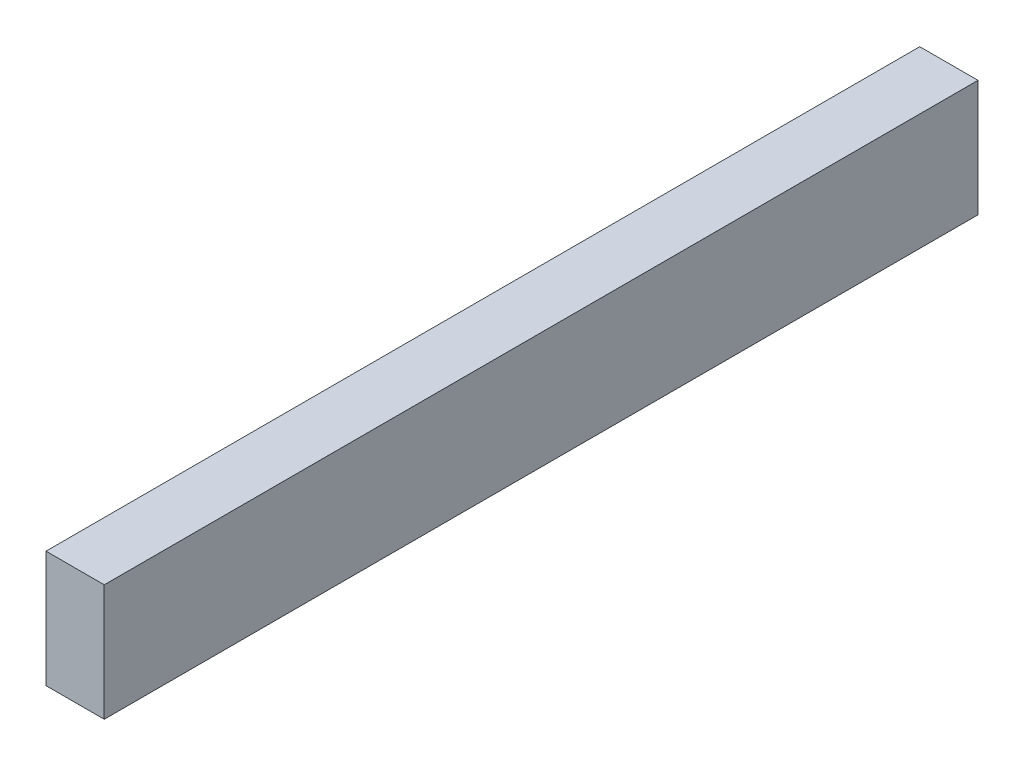
ISO-10303-21;
HEADER;
FILE_DESCRIPTION(('STEP AP214'),'2;1');
FILE_NAME('part.step','',(''),(''),'','','');
FILE_SCHEMA(('AUTOMOTIVE_DESIGN { 1 0 10303 214 1 1 1 1 }'));
ENDSEC;
DATA;
#1=APPLICATION_CONTEXT('core data for automotive mechanical design processes');
#2=APPLICATION_PROTOCOL_DEFINITION('international standard','automotive_design',2000,#1);
#3=PRODUCT_CONTEXT('',#1,'mechanical');
#4=PRODUCT('Part','Part','',(#3));
#5=PRODUCT_RELATED_PRODUCT_CATEGORY('part','',(#4));
#6=PRODUCT_DEFINITION_FORMATION('','',#4);
#7=PRODUCT_DEFINITION_CONTEXT('part definition',#1,'design');
#8=PRODUCT_DEFINITION('design','',#6,#7);
#9=PRODUCT_DEFINITION_SHAPE('','',#8);
#10=(LENGTH_UNIT() NAMED_UNIT(*) SI_UNIT(.MILLI.,.METRE.));
#11=(NAMED_UNIT(*) PLANE_ANGLE_UNIT() SI_UNIT($,.RADIAN.));
#12=(NAMED_UNIT(*) SI_UNIT($,.STERADIAN.) SOLID_ANGLE_UNIT());
#13=UNCERTAINTY_MEASURE_WITH_UNIT(LENGTH_MEASURE(1.E-05),#10,'distance_accuracy_value','');
#14=(GEOMETRIC_REPRESENTATION_CONTEXT(3) GLOBAL_UNCERTAINTY_ASSIGNED_CONTEXT((#13)) GLOBAL_UNIT_ASSIGNED_CONTEXT((#10,
#11,#12)) REPRESENTATION_CONTEXT('',''));
#15=CARTESIAN_POINT('',(0.,0.,0.));
#16=DIRECTION('',(0.,0.,1.));
#17=DIRECTION('',(1.,0.,0.));
#18=AXIS2_PLACEMENT_3D('',#15,#16,#17);
#19=CARTESIAN_POINT('',(0.,0.,381.));
#20=DIRECTION('',(1.,0.,0.));
#21=DIRECTION('',(0.,0.,-1.));
#22=AXIS2_PLACEMENT_3D('',#19,#20,#21);
#23=PLANE('',#22);
#24=DIRECTION('',(0.,-1.,0.));
#25=VECTOR('',#24,1.);
#26=CARTESIAN_POINT('',(0.,0.,0.));
#27=LINE('',#26,#25);
#28=CARTESIAN_POINT('',(0.,50.8,0.));
#29=VERTEX_POINT('',#28);
#30=CARTESIAN_POINT('',(0.,0.,0.));
#31=VERTEX_POINT('',#30);
#32=EDGE_CURVE('E111',#29,#31,#27,.T.);
#33=ORIENTED_EDGE('',*,*,#32,.T.);
#34=DIRECTION('',(0.,0.,-1.));
#35=VECTOR('',#34,1.);
#36=CARTESIAN_POINT('',(0.,0.,381.));
#37=LINE('',#36,#35);
#38=CARTESIAN_POINT('',(0.,0.,381.));
#39=VERTEX_POINT('',#38);
#40=EDGE_CURVE('E11',#39,#31,#37,.T.);
#41=ORIENTED_EDGE('',*,*,#40,.F.);
#42=DIRECTION('',(0.,-1.,0.));
#43=VECTOR('',#42,1.);
#44=CARTESIAN_POINT('',(0.,0.,381.));
#45=LINE('',#44,#43);
#46=CARTESIAN_POINT('',(0.,50.8,381.));
#47=VERTEX_POINT('',#46);
#48=EDGE_CURVE('E95',#47,#39,#45,.T.);
#49=ORIENTED_EDGE('',*,*,#48,.F.);
#50=DIRECTION('',(0.,0.,-1.));
#51=VECTOR('',#50,1.);
#52=CARTESIAN_POINT('',(0.,50.8,381.));
#53=LINE('',#52,#51);
#54=EDGE_CURVE('E107',#47,#29,#53,.T.);
#55=ORIENTED_EDGE('',*,*,#54,.T.);
#56=EDGE_LOOP('',(#33,#41,#49,#55));
#57=FACE_BOUND('',#56,.T.);
#58=ADVANCED_FACE('F43',(#57),#23,.F.);
#59=CARTESIAN_POINT('',(0.,0.,381.));
#60=DIRECTION('',(0.,1.,0.));
#61=DIRECTION('',(0.,0.,1.));
#62=AXIS2_PLACEMENT_3D('',#59,#60,#61);
#63=PLANE('',#62);
#64=DIRECTION('',(1.,0.,0.));
#65=VECTOR('',#64,1.);
#66=CARTESIAN_POINT('',(0.,0.,0.));
#67=LINE('',#66,#65);
#68=CARTESIAN_POINT('',(25.4,0.,0.));
#69=VERTEX_POINT('',#68);
#70=EDGE_CURVE('E100',#31,#69,#67,.T.);
#71=ORIENTED_EDGE('',*,*,#70,.T.);
#72=DIRECTION('',(0.,0.,-1.));
#73=VECTOR('',#72,1.);
#74=CARTESIAN_POINT('',(25.4,0.,381.));
#75=LINE('',#74,#73);
#76=CARTESIAN_POINT('',(25.4,0.,381.));
#77=VERTEX_POINT('',#76);
#78=EDGE_CURVE('E52',#77,#69,#75,.T.);
#79=ORIENTED_EDGE('',*,*,#78,.F.);
#80=DIRECTION('',(1.,0.,0.));
#81=VECTOR('',#80,1.);
#82=CARTESIAN_POINT('',(0.,0.,381.));
#83=LINE('',#82,#81);
#84=EDGE_CURVE('E90',#39,#77,#83,.T.);
#85=ORIENTED_EDGE('',*,*,#84,.F.);
#86=ORIENTED_EDGE('',*,*,#40,.T.);
#87=EDGE_LOOP('',(#71,#79,#85,#86));
#88=FACE_BOUND('',#87,.T.);
#89=ADVANCED_FACE('F99',(#88),#63,.F.);
#90=CARTESIAN_POINT('',(25.4,0.,381.));
#91=DIRECTION('',(-1.,0.,0.));
#92=DIRECTION('',(0.,0.,1.));
#93=AXIS2_PLACEMENT_3D('',#90,#91,#92);
#94=PLANE('',#93);
#95=DIRECTION('',(0.,1.,0.));
#96=VECTOR('',#95,1.);
#97=CARTESIAN_POINT('',(25.4,0.,0.));
#98=LINE('',#97,#96);
#99=CARTESIAN_POINT('',(25.4,50.8,0.));
#100=VERTEX_POINT('',#99);
#101=EDGE_CURVE('E77',#69,#100,#98,.T.);
#102=ORIENTED_EDGE('',*,*,#101,.T.);
#103=DIRECTION('',(0.,0.,-1.));
#104=VECTOR('',#103,1.);
#105=CARTESIAN_POINT('',(25.4,50.8,381.));
#106=LINE('',#105,#104);
#107=CARTESIAN_POINT('',(25.4,50.8,381.));
#108=VERTEX_POINT('',#107);
#109=EDGE_CURVE('E102',#108,#100,#106,.T.);
#110=ORIENTED_EDGE('',*,*,#109,.F.);
#111=DIRECTION('',(0.,1.,0.));
#112=VECTOR('',#111,1.);
#113=CARTESIAN_POINT('',(25.4,0.,381.));
#114=LINE('',#113,#112);
#115=EDGE_CURVE('E93',#77,#108,#114,.T.);
#116=ORIENTED_EDGE('',*,*,#115,.F.);
#117=ORIENTED_EDGE('',*,*,#78,.T.);
#118=EDGE_LOOP('',(#102,#110,#116,#117));
#119=FACE_BOUND('',#118,.T.);
#120=ADVANCED_FACE('F103',(#119),#94,.F.);
#121=CARTESIAN_POINT('',(0.,50.8,381.));
#122=DIRECTION('',(0.,-1.,0.));
#123=DIRECTION('',(0.,0.,-1.));
#124=AXIS2_PLACEMENT_3D('',#121,#122,#123);
#125=PLANE('',#124);
#126=DIRECTION('',(-1.,0.,0.));
#127=VECTOR('',#126,1.);
#128=CARTESIAN_POINT('',(0.,50.8,0.));
#129=LINE('',#128,#127);
#130=EDGE_CURVE('E83',#100,#29,#129,.T.);
#131=ORIENTED_EDGE('',*,*,#130,.T.);
#132=ORIENTED_EDGE('',*,*,#54,.F.);
#133=DIRECTION('',(-1.,0.,0.));
#134=VECTOR('',#133,1.);
#135=CARTESIAN_POINT('',(0.,50.8,381.));
#136=LINE('',#135,#134);
#137=EDGE_CURVE('E60',#108,#47,#136,.T.);
#138=ORIENTED_EDGE('',*,*,#137,.F.);
#139=ORIENTED_EDGE('',*,*,#109,.T.);
#140=EDGE_LOOP('',(#131,#132,#138,#139));
#141=FACE_BOUND('',#140,.T.);
#142=ADVANCED_FACE('F124',(#141),#125,.F.);
#143=CARTESIAN_POINT('',(0.,0.,381.));
#144=DIRECTION('',(0.,0.,-1.));
#145=DIRECTION('',(-1.,0.,0.));
#146=AXIS2_PLACEMENT_3D('',#143,#144,#145);
#147=PLANE('',#146);
#148=ORIENTED_EDGE('',*,*,#48,.T.);
#149=ORIENTED_EDGE('',*,*,#84,.T.);
#150=ORIENTED_EDGE('',*,*,#115,.T.);
#151=ORIENTED_EDGE('',*,*,#137,.T.);
#152=EDGE_LOOP('',(#148,#149,#150,#151));
#153=FACE_BOUND('',#152,.T.);
#154=ADVANCED_FACE('F91',(#153),#147,.F.);
#155=CARTESIAN_POINT('',(0.,0.,0.));
#156=DIRECTION('',(0.,0.,-1.));
#157=DIRECTION('',(-1.,0.,0.));
#158=AXIS2_PLACEMENT_3D('',#155,#156,#157);
#159=PLANE('',#158);
#160=ORIENTED_EDGE('',*,*,#32,.F.);
#161=ORIENTED_EDGE('',*,*,#130,.F.);
#162=ORIENTED_EDGE('',*,*,#101,.F.);
#163=ORIENTED_EDGE('',*,*,#70,.F.);
#164=EDGE_LOOP('',(#160,#161,#162,#163));
#165=FACE_BOUND('',#164,.T.);
#166=ADVANCED_FACE('F127',(#165),#159,.T.);
#167=CLOSED_SHELL('',(#58,#89,#120,#142,#154,#166));
#168=MANIFOLD_SOLID_BREP('B2',#167);
#169=ADVANCED_BREP_SHAPE_REPRESENTATION('',(#18,#168),#14);
#170=SHAPE_DEFINITION_REPRESENTATION(#9,#169);
ENDSEC;
END-ISO-10303-21;
